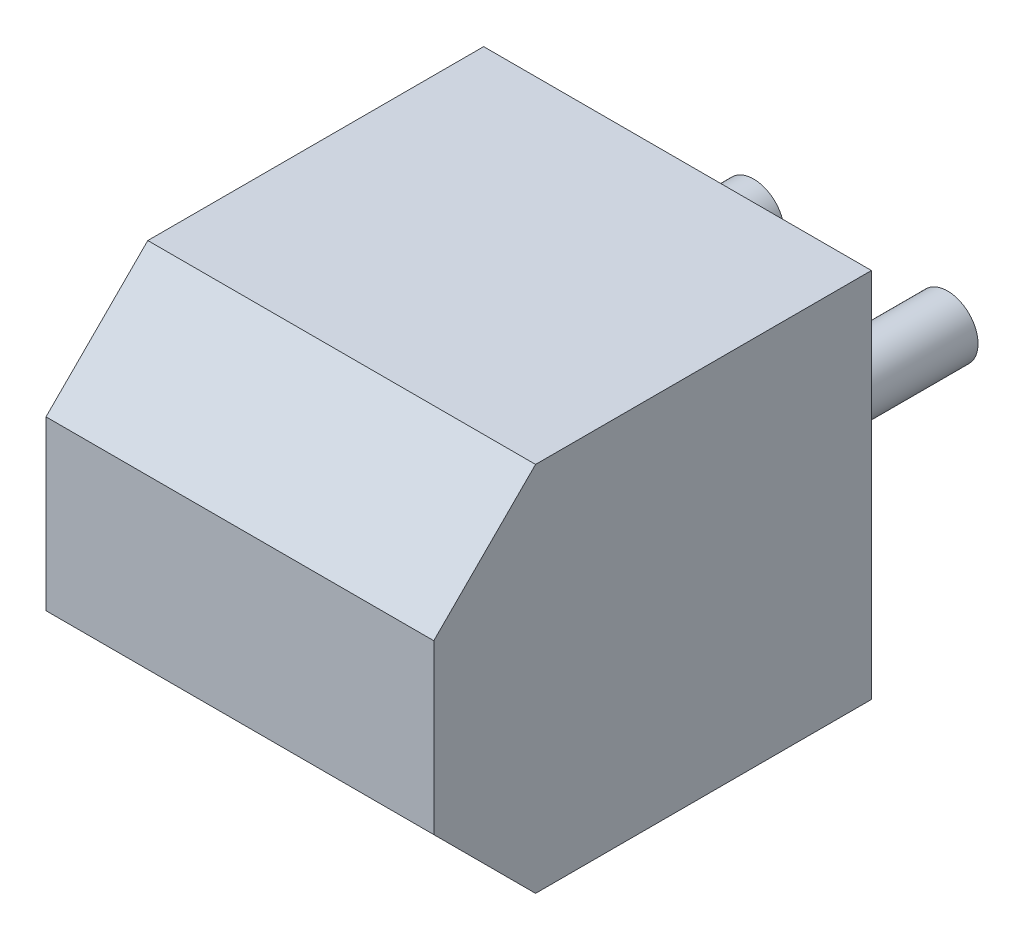
ISO-10303-21;
HEADER;
FILE_DESCRIPTION(('STEP AP214'),'2;1');
FILE_NAME('part.step','',(''),(''),'','','');
FILE_SCHEMA(('AUTOMOTIVE_DESIGN { 1 0 10303 214 1 1 1 1 }'));
ENDSEC;
DATA;
#1=APPLICATION_CONTEXT('core data for automotive mechanical design processes');
#2=APPLICATION_PROTOCOL_DEFINITION('international standard','automotive_design',2000,#1);
#3=PRODUCT_CONTEXT('',#1,'mechanical');
#4=PRODUCT('Part','Part','',(#3));
#5=PRODUCT_RELATED_PRODUCT_CATEGORY('part','',(#4));
#6=PRODUCT_DEFINITION_FORMATION('','',#4);
#7=PRODUCT_DEFINITION_CONTEXT('part definition',#1,'design');
#8=PRODUCT_DEFINITION('design','',#6,#7);
#9=PRODUCT_DEFINITION_SHAPE('','',#8);
#10=(LENGTH_UNIT() NAMED_UNIT(*) SI_UNIT(.MILLI.,.METRE.));
#11=(NAMED_UNIT(*) PLANE_ANGLE_UNIT() SI_UNIT($,.RADIAN.));
#12=(NAMED_UNIT(*) SI_UNIT($,.STERADIAN.) SOLID_ANGLE_UNIT());
#13=UNCERTAINTY_MEASURE_WITH_UNIT(LENGTH_MEASURE(1.E-05),#10,'distance_accuracy_value','');
#14=(GEOMETRIC_REPRESENTATION_CONTEXT(3) GLOBAL_UNCERTAINTY_ASSIGNED_CONTEXT((#13)) GLOBAL_UNIT_ASSIGNED_CONTEXT((#10,
#11,#12)) REPRESENTATION_CONTEXT('',''));
#15=CARTESIAN_POINT('',(0.,0.,0.));
#16=DIRECTION('',(0.,0.,1.));
#17=DIRECTION('',(1.,0.,0.));
#18=AXIS2_PLACEMENT_3D('',#15,#16,#17);
#19=CARTESIAN_POINT('',(0.,0.,0.));
#20=DIRECTION('',(0.,0.,-1.));
#21=DIRECTION('',(-1.,0.,0.));
#22=AXIS2_PLACEMENT_3D('',#19,#20,#21);
#23=PLANE('',#22);
#24=CARTESIAN_POINT('',(5.715,3.7,0.));
#25=DIRECTION('',(0.,0.,-1.));
#26=DIRECTION('',(-1.,0.,0.));
#27=AXIS2_PLACEMENT_3D('',#24,#25,#26);
#28=CIRCLE('',#27,0.6);
#29=CARTESIAN_POINT('',(5.115,3.7,0.));
#30=VERTEX_POINT('',#29);
#31=EDGE_CURVE('E162',#30,#30,#28,.T.);
#32=ORIENTED_EDGE('',*,*,#31,.F.);
#33=EDGE_LOOP('',(#32));
#34=FACE_BOUND('',#33,.T.);
#35=DIRECTION('',(0.,-1.,0.));
#36=VECTOR('',#35,1.);
#37=CARTESIAN_POINT('',(0.,0.,0.));
#38=LINE('',#37,#36);
#39=CARTESIAN_POINT('',(0.,7.3,0.));
#40=VERTEX_POINT('',#39);
#41=CARTESIAN_POINT('',(0.,0.,0.));
#42=VERTEX_POINT('',#41);
#43=EDGE_CURVE('E203',#40,#42,#38,.T.);
#44=ORIENTED_EDGE('',*,*,#43,.F.);
#45=DIRECTION('',(-1.,0.,0.));
#46=VECTOR('',#45,1.);
#47=CARTESIAN_POINT('',(0.,7.3,0.));
#48=LINE('',#47,#46);
#49=CARTESIAN_POINT('',(7.62,7.3,0.));
#50=VERTEX_POINT('',#49);
#51=EDGE_CURVE('E213',#50,#40,#48,.T.);
#52=ORIENTED_EDGE('',*,*,#51,.F.);
#53=DIRECTION('',(0.,1.,0.));
#54=VECTOR('',#53,1.);
#55=CARTESIAN_POINT('',(7.62,0.,0.));
#56=LINE('',#55,#54);
#57=CARTESIAN_POINT('',(7.62,0.,0.));
#58=VERTEX_POINT('',#57);
#59=EDGE_CURVE('E222',#58,#50,#56,.T.);
#60=ORIENTED_EDGE('',*,*,#59,.F.);
#61=DIRECTION('',(1.,0.,0.));
#62=VECTOR('',#61,1.);
#63=CARTESIAN_POINT('',(0.,0.,0.));
#64=LINE('',#63,#62);
#65=EDGE_CURVE('E219',#42,#58,#64,.T.);
#66=ORIENTED_EDGE('',*,*,#65,.F.);
#67=EDGE_LOOP('',(#44,#52,#60,#66));
#68=FACE_BOUND('',#67,.T.);
#69=CARTESIAN_POINT('',(1.905,3.7,0.));
#70=DIRECTION('',(0.,0.,-1.));
#71=DIRECTION('',(-1.,0.,0.));
#72=AXIS2_PLACEMENT_3D('',#69,#70,#71);
#73=CIRCLE('',#72,0.6);
#74=CARTESIAN_POINT('',(1.305,3.7,0.));
#75=VERTEX_POINT('',#74);
#76=EDGE_CURVE('E348',#75,#75,#73,.T.);
#77=ORIENTED_EDGE('',*,*,#76,.F.);
#78=EDGE_LOOP('',(#77));
#79=FACE_BOUND('',#78,.T.);
#80=ADVANCED_FACE('F36',(#34,#68,#79),#23,.T.);
#81=CARTESIAN_POINT('',(0.,0.,8.6));
#82=DIRECTION('',(1.,0.,0.));
#83=DIRECTION('',(0.,0.,-1.));
#84=AXIS2_PLACEMENT_3D('',#81,#82,#83);
#85=PLANE('',#84);
#86=DIRECTION('',(0.,0.,-1.));
#87=VECTOR('',#86,1.);
#88=CARTESIAN_POINT('',(0.,0.,8.6));
#89=LINE('',#88,#87);
#90=CARTESIAN_POINT('',(0.,0.,6.59999999999999));
#91=VERTEX_POINT('',#90);
#92=EDGE_CURVE('E232',#91,#42,#89,.T.);
#93=ORIENTED_EDGE('',*,*,#92,.F.);
#94=DIRECTION('',(0.,-0.707106781186546,-0.707106781186549));
#95=VECTOR('',#94,1.);
#96=CARTESIAN_POINT('',(0.,2.,8.6));
#97=LINE('',#96,#95);
#98=CARTESIAN_POINT('',(0.,2.,8.6));
#99=VERTEX_POINT('',#98);
#100=EDGE_CURVE('E44',#91,#99,#97,.F.);
#101=ORIENTED_EDGE('',*,*,#100,.T.);
#102=DIRECTION('',(0.,-1.,0.));
#103=VECTOR('',#102,1.);
#104=CARTESIAN_POINT('',(0.,0.,8.6));
#105=LINE('',#104,#103);
#106=CARTESIAN_POINT('',(0.,5.3,8.6));
#107=VERTEX_POINT('',#106);
#108=EDGE_CURVE('E209',#107,#99,#105,.T.);
#109=ORIENTED_EDGE('',*,*,#108,.F.);
#110=DIRECTION('',(0.,-0.707106781186546,0.707106781186549));
#111=VECTOR('',#110,1.);
#112=CARTESIAN_POINT('',(0.,5.3,8.6));
#113=LINE('',#112,#111);
#114=CARTESIAN_POINT('',(0.,7.3,6.59999999999999));
#115=VERTEX_POINT('',#114);
#116=EDGE_CURVE('E246',#107,#115,#113,.F.);
#117=ORIENTED_EDGE('',*,*,#116,.T.);
#118=DIRECTION('',(0.,0.,-1.));
#119=VECTOR('',#118,1.);
#120=CARTESIAN_POINT('',(0.,7.3,8.6));
#121=LINE('',#120,#119);
#122=EDGE_CURVE('E216',#115,#40,#121,.T.);
#123=ORIENTED_EDGE('',*,*,#122,.T.);
#124=ORIENTED_EDGE('',*,*,#43,.T.);
#125=EDGE_LOOP('',(#93,#101,#109,#117,#123,#124));
#126=FACE_BOUND('',#125,.T.);
#127=ADVANCED_FACE('F251',(#126),#85,.F.);
#128=CARTESIAN_POINT('',(0.,0.,8.6));
#129=DIRECTION('',(0.,1.,0.));
#130=DIRECTION('',(0.,0.,1.));
#131=AXIS2_PLACEMENT_3D('',#128,#129,#130);
#132=PLANE('',#131);
#133=DIRECTION('',(1.,0.,0.));
#134=VECTOR('',#133,1.);
#135=CARTESIAN_POINT('',(4.965,0.,2.47967746024681));
#136=LINE('',#135,#134);
#137=CARTESIAN_POINT('',(4.965,0.,2.47967746024681));
#138=VERTEX_POINT('',#137);
#139=CARTESIAN_POINT('',(6.465,0.,2.47967746024681));
#140=VERTEX_POINT('',#139);
#141=EDGE_CURVE('E168',#138,#140,#136,.T.);
#142=ORIENTED_EDGE('',*,*,#141,.F.);
#143=DIRECTION('',(0.,0.,-1.));
#144=VECTOR('',#143,1.);
#145=CARTESIAN_POINT('',(4.965,0.,4.72443805466152));
#146=LINE('',#145,#144);
#147=CARTESIAN_POINT('',(4.965,0.,4.72443805466152));
#148=VERTEX_POINT('',#147);
#149=EDGE_CURVE('E51',#148,#138,#146,.T.);
#150=ORIENTED_EDGE('',*,*,#149,.F.);
#151=DIRECTION('',(-1.,0.,0.));
#152=VECTOR('',#151,1.);
#153=CARTESIAN_POINT('',(4.965,0.,4.72443805466152));
#154=LINE('',#153,#152);
#155=CARTESIAN_POINT('',(6.465,0.,4.72443805466152));
#156=VERTEX_POINT('',#155);
#157=EDGE_CURVE('E156',#156,#148,#154,.T.);
#158=ORIENTED_EDGE('',*,*,#157,.F.);
#159=DIRECTION('',(0.,0.,1.));
#160=VECTOR('',#159,1.);
#161=CARTESIAN_POINT('',(6.465,0.,4.72443805466152));
#162=LINE('',#161,#160);
#163=EDGE_CURVE('E159',#140,#156,#162,.T.);
#164=ORIENTED_EDGE('',*,*,#163,.F.);
#165=EDGE_LOOP('',(#142,#150,#158,#164));
#166=FACE_BOUND('',#165,.T.);
#167=DIRECTION('',(1.,0.,0.));
#168=VECTOR('',#167,1.);
#169=CARTESIAN_POINT('',(1.155,0.,2.47967746024681));
#170=LINE('',#169,#168);
#171=CARTESIAN_POINT('',(1.155,0.,2.47967746024681));
#172=VERTEX_POINT('',#171);
#173=CARTESIAN_POINT('',(2.655,0.,2.47967746024681));
#174=VERTEX_POINT('',#173);
#175=EDGE_CURVE('E193',#172,#174,#170,.T.);
#176=ORIENTED_EDGE('',*,*,#175,.F.);
#177=DIRECTION('',(0.,0.,-1.));
#178=VECTOR('',#177,1.);
#179=CARTESIAN_POINT('',(1.155,0.,4.72443805466152));
#180=LINE('',#179,#178);
#181=CARTESIAN_POINT('',(1.155,0.,4.72443805466152));
#182=VERTEX_POINT('',#181);
#183=EDGE_CURVE('E59',#182,#172,#180,.T.);
#184=ORIENTED_EDGE('',*,*,#183,.F.);
#185=DIRECTION('',(-1.,0.,0.));
#186=VECTOR('',#185,1.);
#187=CARTESIAN_POINT('',(1.155,0.,4.72443805466152));
#188=LINE('',#187,#186);
#189=CARTESIAN_POINT('',(2.655,0.,4.72443805466152));
#190=VERTEX_POINT('',#189);
#191=EDGE_CURVE('E182',#190,#182,#188,.T.);
#192=ORIENTED_EDGE('',*,*,#191,.F.);
#193=DIRECTION('',(0.,0.,1.));
#194=VECTOR('',#193,1.);
#195=CARTESIAN_POINT('',(2.655,0.,4.72443805466152));
#196=LINE('',#195,#194);
#197=EDGE_CURVE('E196',#174,#190,#196,.T.);
#198=ORIENTED_EDGE('',*,*,#197,.F.);
#199=EDGE_LOOP('',(#176,#184,#192,#198));
#200=FACE_BOUND('',#199,.T.);
#201=DIRECTION('',(0.,0.,-1.));
#202=VECTOR('',#201,1.);
#203=CARTESIAN_POINT('',(7.62,0.,8.6));
#204=LINE('',#203,#202);
#205=CARTESIAN_POINT('',(7.62,0.,6.59999999999999));
#206=VERTEX_POINT('',#205);
#207=EDGE_CURVE('E230',#206,#58,#204,.T.);
#208=ORIENTED_EDGE('',*,*,#207,.F.);
#209=DIRECTION('',(-1.,0.,0.));
#210=VECTOR('',#209,1.);
#211=CARTESIAN_POINT('',(0.,0.,6.59999999999999));
#212=LINE('',#211,#210);
#213=EDGE_CURVE('E244',#206,#91,#212,.T.);
#214=ORIENTED_EDGE('',*,*,#213,.T.);
#215=ORIENTED_EDGE('',*,*,#92,.T.);
#216=ORIENTED_EDGE('',*,*,#65,.T.);
#217=EDGE_LOOP('',(#208,#214,#215,#216));
#218=FACE_BOUND('',#217,.T.);
#219=ADVANCED_FACE('F264',(#166,#200,#218),#132,.F.);
#220=CARTESIAN_POINT('',(7.62,0.,8.6));
#221=DIRECTION('',(-1.,0.,0.));
#222=DIRECTION('',(0.,0.,1.));
#223=AXIS2_PLACEMENT_3D('',#220,#221,#222);
#224=PLANE('',#223);
#225=DIRECTION('',(0.,1.,0.));
#226=VECTOR('',#225,1.);
#227=CARTESIAN_POINT('',(7.62,0.,8.6));
#228=LINE('',#227,#226);
#229=CARTESIAN_POINT('',(7.62,2.,8.6));
#230=VERTEX_POINT('',#229);
#231=CARTESIAN_POINT('',(7.62,5.3,8.6));
#232=VERTEX_POINT('',#231);
#233=EDGE_CURVE('E212',#230,#232,#228,.T.);
#234=ORIENTED_EDGE('',*,*,#233,.F.);
#235=DIRECTION('',(0.,0.707106781186546,0.707106781186549));
#236=VECTOR('',#235,1.);
#237=CARTESIAN_POINT('',(7.62,2.,8.6));
#238=LINE('',#237,#236);
#239=EDGE_CURVE('E242',#230,#206,#238,.F.);
#240=ORIENTED_EDGE('',*,*,#239,.T.);
#241=ORIENTED_EDGE('',*,*,#207,.T.);
#242=ORIENTED_EDGE('',*,*,#59,.T.);
#243=DIRECTION('',(0.,0.,-1.));
#244=VECTOR('',#243,1.);
#245=CARTESIAN_POINT('',(7.62,7.3,8.6));
#246=LINE('',#245,#244);
#247=CARTESIAN_POINT('',(7.62,7.3,6.59999999999999));
#248=VERTEX_POINT('',#247);
#249=EDGE_CURVE('E228',#248,#50,#246,.T.);
#250=ORIENTED_EDGE('',*,*,#249,.F.);
#251=DIRECTION('',(0.,0.707106781186546,-0.707106781186549));
#252=VECTOR('',#251,1.);
#253=CARTESIAN_POINT('',(7.62,5.3,8.6));
#254=LINE('',#253,#252);
#255=EDGE_CURVE('E240',#248,#232,#254,.F.);
#256=ORIENTED_EDGE('',*,*,#255,.T.);
#257=EDGE_LOOP('',(#234,#240,#241,#242,#250,#256));
#258=FACE_BOUND('',#257,.T.);
#259=ADVANCED_FACE('F262',(#258),#224,.F.);
#260=CARTESIAN_POINT('',(0.,7.3,8.6));
#261=DIRECTION('',(0.,-1.,0.));
#262=DIRECTION('',(0.,0.,-1.));
#263=AXIS2_PLACEMENT_3D('',#260,#261,#262);
#264=PLANE('',#263);
#265=ORIENTED_EDGE('',*,*,#122,.F.);
#266=DIRECTION('',(1.,0.,0.));
#267=VECTOR('',#266,1.);
#268=CARTESIAN_POINT('',(0.,7.3,6.59999999999999));
#269=LINE('',#268,#267);
#270=EDGE_CURVE('E11',#115,#248,#269,.T.);
#271=ORIENTED_EDGE('',*,*,#270,.T.);
#272=ORIENTED_EDGE('',*,*,#249,.T.);
#273=ORIENTED_EDGE('',*,*,#51,.T.);
#274=EDGE_LOOP('',(#265,#271,#272,#273));
#275=FACE_BOUND('',#274,.T.);
#276=ADVANCED_FACE('F277',(#275),#264,.F.);
#277=CARTESIAN_POINT('',(0.,0.,8.6));
#278=DIRECTION('',(0.,0.,-1.));
#279=DIRECTION('',(-1.,0.,0.));
#280=AXIS2_PLACEMENT_3D('',#277,#278,#279);
#281=PLANE('',#280);
#282=ORIENTED_EDGE('',*,*,#108,.T.);
#283=DIRECTION('',(1.,0.,0.));
#284=VECTOR('',#283,1.);
#285=CARTESIAN_POINT('',(0.,2.,8.6));
#286=LINE('',#285,#284);
#287=EDGE_CURVE('E237',#99,#230,#286,.T.);
#288=ORIENTED_EDGE('',*,*,#287,.T.);
#289=ORIENTED_EDGE('',*,*,#233,.T.);
#290=DIRECTION('',(-1.,0.,0.));
#291=VECTOR('',#290,1.);
#292=CARTESIAN_POINT('',(0.,5.3,8.6));
#293=LINE('',#292,#291);
#294=EDGE_CURVE('E234',#232,#107,#293,.T.);
#295=ORIENTED_EDGE('',*,*,#294,.T.);
#296=EDGE_LOOP('',(#282,#288,#289,#295));
#297=FACE_BOUND('',#296,.T.);
#298=ADVANCED_FACE('F256',(#297),#281,.F.);
#299=CARTESIAN_POINT('',(0.,2.,8.6));
#300=DIRECTION('',(0.,0.707106781186549,-0.707106781186546));
#301=DIRECTION('',(1.,0.,0.));
#302=AXIS2_PLACEMENT_3D('',#299,#300,#301);
#303=PLANE('',#302);
#304=ORIENTED_EDGE('',*,*,#100,.F.);
#305=ORIENTED_EDGE('',*,*,#213,.F.);
#306=ORIENTED_EDGE('',*,*,#239,.F.);
#307=ORIENTED_EDGE('',*,*,#287,.F.);
#308=EDGE_LOOP('',(#304,#305,#306,#307));
#309=FACE_BOUND('',#308,.T.);
#310=ADVANCED_FACE('F259',(#309),#303,.F.);
#311=CARTESIAN_POINT('',(0.,5.3,8.6));
#312=DIRECTION('',(0.,-0.707106781186549,-0.707106781186546));
#313=DIRECTION('',(-1.,0.,0.));
#314=AXIS2_PLACEMENT_3D('',#311,#312,#313);
#315=PLANE('',#314);
#316=ORIENTED_EDGE('',*,*,#255,.F.);
#317=ORIENTED_EDGE('',*,*,#270,.F.);
#318=ORIENTED_EDGE('',*,*,#116,.F.);
#319=ORIENTED_EDGE('',*,*,#294,.F.);
#320=EDGE_LOOP('',(#316,#317,#318,#319));
#321=FACE_BOUND('',#320,.T.);
#322=ADVANCED_FACE('F38',(#321),#315,.F.);
#323=CARTESIAN_POINT('',(1.155,0.5,4.72443805466152));
#324=DIRECTION('',(-1.,0.,0.));
#325=DIRECTION('',(0.,0.,1.));
#326=AXIS2_PLACEMENT_3D('',#323,#324,#325);
#327=PLANE('',#326);
#328=ORIENTED_EDGE('',*,*,#183,.T.);
#329=DIRECTION('',(0.,-1.,0.));
#330=VECTOR('',#329,1.);
#331=CARTESIAN_POINT('',(1.155,0.5,2.47967746024681));
#332=LINE('',#331,#330);
#333=CARTESIAN_POINT('',(1.155,0.5,2.47967746024681));
#334=VERTEX_POINT('',#333);
#335=EDGE_CURVE('E191',#334,#172,#332,.T.);
#336=ORIENTED_EDGE('',*,*,#335,.F.);
#337=DIRECTION('',(0.,0.,-1.));
#338=VECTOR('',#337,1.);
#339=CARTESIAN_POINT('',(1.155,0.5,4.72443805466152));
#340=LINE('',#339,#338);
#341=CARTESIAN_POINT('',(1.155,0.5,4.72443805466152));
#342=VERTEX_POINT('',#341);
#343=EDGE_CURVE('E178',#342,#334,#340,.T.);
#344=ORIENTED_EDGE('',*,*,#343,.F.);
#345=DIRECTION('',(0.,-1.,0.));
#346=VECTOR('',#345,1.);
#347=CARTESIAN_POINT('',(1.155,0.5,4.72443805466152));
#348=LINE('',#347,#346);
#349=EDGE_CURVE('E201',#342,#182,#348,.T.);
#350=ORIENTED_EDGE('',*,*,#349,.T.);
#351=EDGE_LOOP('',(#328,#336,#344,#350));
#352=FACE_BOUND('',#351,.T.);
#353=ADVANCED_FACE('F295',(#352),#327,.F.);
#354=CARTESIAN_POINT('',(1.155,0.5,4.72443805466152));
#355=DIRECTION('',(0.,0.,1.));
#356=DIRECTION('',(1.,0.,0.));
#357=AXIS2_PLACEMENT_3D('',#354,#355,#356);
#358=PLANE('',#357);
#359=ORIENTED_EDGE('',*,*,#191,.T.);
#360=ORIENTED_EDGE('',*,*,#349,.F.);
#361=DIRECTION('',(-1.,0.,0.));
#362=VECTOR('',#361,1.);
#363=CARTESIAN_POINT('',(1.155,0.5,4.72443805466152));
#364=LINE('',#363,#362);
#365=CARTESIAN_POINT('',(2.655,0.5,4.72443805466152));
#366=VERTEX_POINT('',#365);
#367=EDGE_CURVE('E188',#366,#342,#364,.T.);
#368=ORIENTED_EDGE('',*,*,#367,.F.);
#369=DIRECTION('',(0.,-1.,0.));
#370=VECTOR('',#369,1.);
#371=CARTESIAN_POINT('',(2.655,0.5,4.72443805466152));
#372=LINE('',#371,#370);
#373=EDGE_CURVE('E204',#366,#190,#372,.T.);
#374=ORIENTED_EDGE('',*,*,#373,.T.);
#375=EDGE_LOOP('',(#359,#360,#368,#374));
#376=FACE_BOUND('',#375,.T.);
#377=ADVANCED_FACE('F298',(#376),#358,.F.);
#378=CARTESIAN_POINT('',(2.655,0.5,4.72443805466152));
#379=DIRECTION('',(1.,0.,0.));
#380=DIRECTION('',(0.,0.,-1.));
#381=AXIS2_PLACEMENT_3D('',#378,#379,#380);
#382=PLANE('',#381);
#383=ORIENTED_EDGE('',*,*,#197,.T.);
#384=ORIENTED_EDGE('',*,*,#373,.F.);
#385=DIRECTION('',(0.,0.,1.));
#386=VECTOR('',#385,1.);
#387=CARTESIAN_POINT('',(2.655,0.5,4.72443805466152));
#388=LINE('',#387,#386);
#389=CARTESIAN_POINT('',(2.655,0.5,2.47967746024681));
#390=VERTEX_POINT('',#389);
#391=EDGE_CURVE('E185',#390,#366,#388,.T.);
#392=ORIENTED_EDGE('',*,*,#391,.F.);
#393=DIRECTION('',(0.,-1.,0.));
#394=VECTOR('',#393,1.);
#395=CARTESIAN_POINT('',(2.655,0.5,2.47967746024681));
#396=LINE('',#395,#394);
#397=EDGE_CURVE('E206',#390,#174,#396,.T.);
#398=ORIENTED_EDGE('',*,*,#397,.T.);
#399=EDGE_LOOP('',(#383,#384,#392,#398));
#400=FACE_BOUND('',#399,.T.);
#401=ADVANCED_FACE('F303',(#400),#382,.F.);
#402=CARTESIAN_POINT('',(1.155,0.5,2.47967746024681));
#403=DIRECTION('',(0.,0.,-1.));
#404=DIRECTION('',(-1.,0.,0.));
#405=AXIS2_PLACEMENT_3D('',#402,#403,#404);
#406=PLANE('',#405);
#407=ORIENTED_EDGE('',*,*,#175,.T.);
#408=ORIENTED_EDGE('',*,*,#397,.F.);
#409=DIRECTION('',(1.,0.,0.));
#410=VECTOR('',#409,1.);
#411=CARTESIAN_POINT('',(1.155,0.5,2.47967746024681));
#412=LINE('',#411,#410);
#413=EDGE_CURVE('E181',#334,#390,#412,.T.);
#414=ORIENTED_EDGE('',*,*,#413,.F.);
#415=ORIENTED_EDGE('',*,*,#335,.T.);
#416=EDGE_LOOP('',(#407,#408,#414,#415));
#417=FACE_BOUND('',#416,.T.);
#418=ADVANCED_FACE('F299',(#417),#406,.F.);
#419=CARTESIAN_POINT('',(0.,0.5,0.));
#420=DIRECTION('',(0.,-1.,0.));
#421=DIRECTION('',(0.,0.,-1.));
#422=AXIS2_PLACEMENT_3D('',#419,#420,#421);
#423=PLANE('',#422);
#424=ORIENTED_EDGE('',*,*,#343,.T.);
#425=ORIENTED_EDGE('',*,*,#413,.T.);
#426=ORIENTED_EDGE('',*,*,#391,.T.);
#427=ORIENTED_EDGE('',*,*,#367,.T.);
#428=EDGE_LOOP('',(#424,#425,#426,#427));
#429=FACE_BOUND('',#428,.T.);
#430=ADVANCED_FACE('F302',(#429),#423,.T.);
#431=CARTESIAN_POINT('',(4.965,0.5,4.72443805466152));
#432=DIRECTION('',(-1.,0.,0.));
#433=DIRECTION('',(0.,0.,1.));
#434=AXIS2_PLACEMENT_3D('',#431,#432,#433);
#435=PLANE('',#434);
#436=ORIENTED_EDGE('',*,*,#149,.T.);
#437=DIRECTION('',(0.,-1.,0.));
#438=VECTOR('',#437,1.);
#439=CARTESIAN_POINT('',(4.965,0.5,2.47967746024681));
#440=LINE('',#439,#438);
#441=CARTESIAN_POINT('',(4.965,0.5,2.47967746024681));
#442=VERTEX_POINT('',#441);
#443=EDGE_CURVE('E134',#442,#138,#440,.T.);
#444=ORIENTED_EDGE('',*,*,#443,.F.);
#445=DIRECTION('',(0.,0.,-1.));
#446=VECTOR('',#445,1.);
#447=CARTESIAN_POINT('',(4.965,0.5,4.72443805466152));
#448=LINE('',#447,#446);
#449=CARTESIAN_POINT('',(4.965,0.5,4.72443805466152));
#450=VERTEX_POINT('',#449);
#451=EDGE_CURVE('E138',#450,#442,#448,.T.);
#452=ORIENTED_EDGE('',*,*,#451,.F.);
#453=DIRECTION('',(0.,-1.,0.));
#454=VECTOR('',#453,1.);
#455=CARTESIAN_POINT('',(4.965,0.5,4.72443805466152));
#456=LINE('',#455,#454);
#457=EDGE_CURVE('E173',#450,#148,#456,.T.);
#458=ORIENTED_EDGE('',*,*,#457,.T.);
#459=EDGE_LOOP('',(#436,#444,#452,#458));
#460=FACE_BOUND('',#459,.T.);
#461=ADVANCED_FACE('F136',(#460),#435,.F.);
#462=CARTESIAN_POINT('',(4.965,0.5,4.72443805466152));
#463=DIRECTION('',(0.,0.,1.));
#464=DIRECTION('',(1.,0.,0.));
#465=AXIS2_PLACEMENT_3D('',#462,#463,#464);
#466=PLANE('',#465);
#467=ORIENTED_EDGE('',*,*,#157,.T.);
#468=ORIENTED_EDGE('',*,*,#457,.F.);
#469=DIRECTION('',(-1.,0.,0.));
#470=VECTOR('',#469,1.);
#471=CARTESIAN_POINT('',(4.965,0.5,4.72443805466152));
#472=LINE('',#471,#470);
#473=CARTESIAN_POINT('',(6.465,0.5,4.72443805466152));
#474=VERTEX_POINT('',#473);
#475=EDGE_CURVE('E144',#474,#450,#472,.T.);
#476=ORIENTED_EDGE('',*,*,#475,.F.);
#477=DIRECTION('',(0.,-1.,0.));
#478=VECTOR('',#477,1.);
#479=CARTESIAN_POINT('',(6.465,0.5,4.72443805466152));
#480=LINE('',#479,#478);
#481=EDGE_CURVE('E175',#474,#156,#480,.T.);
#482=ORIENTED_EDGE('',*,*,#481,.T.);
#483=EDGE_LOOP('',(#467,#468,#476,#482));
#484=FACE_BOUND('',#483,.T.);
#485=ADVANCED_FACE('F316',(#484),#466,.F.);
#486=CARTESIAN_POINT('',(6.465,0.5,4.72443805466152));
#487=DIRECTION('',(1.,0.,0.));
#488=DIRECTION('',(0.,0.,-1.));
#489=AXIS2_PLACEMENT_3D('',#486,#487,#488);
#490=PLANE('',#489);
#491=ORIENTED_EDGE('',*,*,#163,.T.);
#492=ORIENTED_EDGE('',*,*,#481,.F.);
#493=DIRECTION('',(0.,0.,1.));
#494=VECTOR('',#493,1.);
#495=CARTESIAN_POINT('',(6.465,0.5,4.72443805466152));
#496=LINE('',#495,#494);
#497=CARTESIAN_POINT('',(6.465,0.5,2.47967746024681));
#498=VERTEX_POINT('',#497);
#499=EDGE_CURVE('E152',#498,#474,#496,.T.);
#500=ORIENTED_EDGE('',*,*,#499,.F.);
#501=DIRECTION('',(0.,-1.,0.));
#502=VECTOR('',#501,1.);
#503=CARTESIAN_POINT('',(6.465,0.5,2.47967746024681));
#504=LINE('',#503,#502);
#505=EDGE_CURVE('E143',#498,#140,#504,.T.);
#506=ORIENTED_EDGE('',*,*,#505,.T.);
#507=EDGE_LOOP('',(#491,#492,#500,#506));
#508=FACE_BOUND('',#507,.T.);
#509=ADVANCED_FACE('F319',(#508),#490,.F.);
#510=CARTESIAN_POINT('',(4.965,0.5,2.47967746024681));
#511=DIRECTION('',(0.,0.,-1.));
#512=DIRECTION('',(-1.,0.,0.));
#513=AXIS2_PLACEMENT_3D('',#510,#511,#512);
#514=PLANE('',#513);
#515=ORIENTED_EDGE('',*,*,#141,.T.);
#516=ORIENTED_EDGE('',*,*,#505,.F.);
#517=DIRECTION('',(1.,0.,0.));
#518=VECTOR('',#517,1.);
#519=CARTESIAN_POINT('',(4.965,0.5,2.47967746024681));
#520=LINE('',#519,#518);
#521=EDGE_CURVE('E147',#442,#498,#520,.T.);
#522=ORIENTED_EDGE('',*,*,#521,.F.);
#523=ORIENTED_EDGE('',*,*,#443,.T.);
#524=EDGE_LOOP('',(#515,#516,#522,#523));
#525=FACE_BOUND('',#524,.T.);
#526=ADVANCED_FACE('F148',(#525),#514,.F.);
#527=CARTESIAN_POINT('',(3.81,0.5,0.));
#528=DIRECTION('',(0.,-1.,0.));
#529=DIRECTION('',(0.,0.,-1.));
#530=AXIS2_PLACEMENT_3D('',#527,#528,#529);
#531=PLANE('',#530);
#532=ORIENTED_EDGE('',*,*,#451,.T.);
#533=ORIENTED_EDGE('',*,*,#521,.T.);
#534=ORIENTED_EDGE('',*,*,#499,.T.);
#535=ORIENTED_EDGE('',*,*,#475,.T.);
#536=EDGE_LOOP('',(#532,#533,#534,#535));
#537=FACE_BOUND('',#536,.T.);
#538=ADVANCED_FACE('F154',(#537),#531,.T.);
#539=CARTESIAN_POINT('',(5.715,3.7,-3.4));
#540=DIRECTION('',(0.,0.,1.));
#541=DIRECTION('',(1.,0.,0.));
#542=AXIS2_PLACEMENT_3D('',#539,#540,#541);
#543=CYLINDRICAL_SURFACE('',#542,0.6);
#544=CARTESIAN_POINT('',(5.715,3.7,-3.4));
#545=DIRECTION('',(0.,0.,-1.));
#546=DIRECTION('',(-1.,0.,0.));
#547=AXIS2_PLACEMENT_3D('',#544,#545,#546);
#548=CIRCLE('',#547,0.6);
#549=CARTESIAN_POINT('',(5.115,3.7,-3.4));
#550=VERTEX_POINT('',#549);
#551=EDGE_CURVE('E169',#550,#550,#548,.T.);
#552=ORIENTED_EDGE('',*,*,#551,.F.);
#553=EDGE_LOOP('',(#552));
#554=FACE_BOUND('',#553,.T.);
#555=ORIENTED_EDGE('',*,*,#31,.T.);
#556=EDGE_LOOP('',(#555));
#557=FACE_BOUND('',#556,.T.);
#558=ADVANCED_FACE('F328',(#554,#557),#543,.T.);
#559=CARTESIAN_POINT('',(5.715,3.7,-3.4));
#560=DIRECTION('',(0.,0.,-1.));
#561=DIRECTION('',(-1.,0.,0.));
#562=AXIS2_PLACEMENT_3D('',#559,#560,#561);
#563=PLANE('',#562);
#564=ORIENTED_EDGE('',*,*,#551,.T.);
#565=EDGE_LOOP('',(#564));
#566=FACE_BOUND('',#565,.T.);
#567=ADVANCED_FACE('F331',(#566),#563,.T.);
#568=CARTESIAN_POINT('',(1.905,3.7,-3.4));
#569=DIRECTION('',(0.,0.,1.));
#570=DIRECTION('',(1.,0.,0.));
#571=AXIS2_PLACEMENT_3D('',#568,#569,#570);
#572=CYLINDRICAL_SURFACE('',#571,0.6);
#573=CARTESIAN_POINT('',(1.905,3.7,-3.4));
#574=DIRECTION('',(0.,0.,-1.));
#575=DIRECTION('',(-1.,0.,0.));
#576=AXIS2_PLACEMENT_3D('',#573,#574,#575);
#577=CIRCLE('',#576,0.6);
#578=CARTESIAN_POINT('',(1.305,3.7,-3.4));
#579=VERTEX_POINT('',#578);
#580=EDGE_CURVE('E347',#579,#579,#577,.T.);
#581=ORIENTED_EDGE('',*,*,#580,.F.);
#582=EDGE_LOOP('',(#581));
#583=FACE_BOUND('',#582,.T.);
#584=ORIENTED_EDGE('',*,*,#76,.T.);
#585=EDGE_LOOP('',(#584));
#586=FACE_BOUND('',#585,.T.);
#587=ADVANCED_FACE('F335',(#583,#586),#572,.T.);
#588=CARTESIAN_POINT('',(1.905,3.7,-3.4));
#589=DIRECTION('',(0.,0.,-1.));
#590=DIRECTION('',(-1.,0.,0.));
#591=AXIS2_PLACEMENT_3D('',#588,#589,#590);
#592=PLANE('',#591);
#593=ORIENTED_EDGE('',*,*,#580,.T.);
#594=EDGE_LOOP('',(#593));
#595=FACE_BOUND('',#594,.T.);
#596=ADVANCED_FACE('F339',(#595),#592,.T.);
#597=CLOSED_SHELL('',(#80,#127,#219,#259,#276,#298,#310,#322,#353,#377,#401,#418,#430,#461,#485,
#509,#526,#538,#558,#567,#587,#596));
#598=MANIFOLD_SOLID_BREP('B2',#597);
#599=ADVANCED_BREP_SHAPE_REPRESENTATION('',(#18,#598),#14);
#600=SHAPE_DEFINITION_REPRESENTATION(#9,#599);
ENDSEC;
END-ISO-10303-21;
